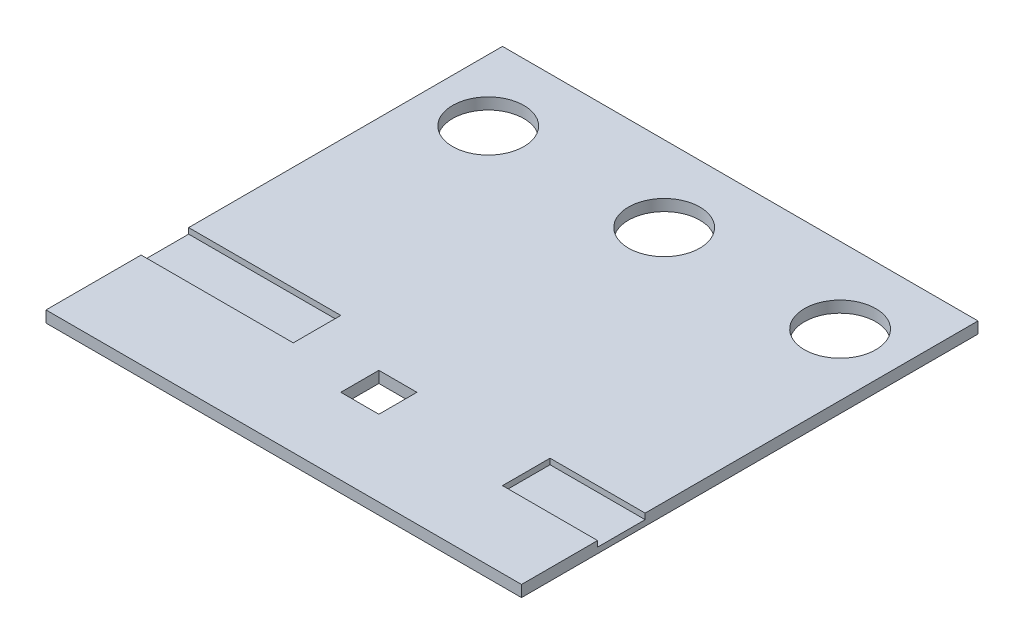
ISO-10303-21;
HEADER;
FILE_DESCRIPTION(('STEP AP214'),'2;1');
FILE_NAME('part.step','',(''),(''),'','','');
FILE_SCHEMA(('AUTOMOTIVE_DESIGN { 1 0 10303 214 1 1 1 1 }'));
ENDSEC;
DATA;
#1=APPLICATION_CONTEXT('core data for automotive mechanical design processes');
#2=APPLICATION_PROTOCOL_DEFINITION('international standard','automotive_design',2000,#1);
#3=PRODUCT_CONTEXT('',#1,'mechanical');
#4=PRODUCT('Part','Part','',(#3));
#5=PRODUCT_RELATED_PRODUCT_CATEGORY('part','',(#4));
#6=PRODUCT_DEFINITION_FORMATION('','',#4);
#7=PRODUCT_DEFINITION_CONTEXT('part definition',#1,'design');
#8=PRODUCT_DEFINITION('design','',#6,#7);
#9=PRODUCT_DEFINITION_SHAPE('','',#8);
#10=(LENGTH_UNIT() NAMED_UNIT(*) SI_UNIT(.MILLI.,.METRE.));
#11=(NAMED_UNIT(*) PLANE_ANGLE_UNIT() SI_UNIT($,.RADIAN.));
#12=(NAMED_UNIT(*) SI_UNIT($,.STERADIAN.) SOLID_ANGLE_UNIT());
#13=UNCERTAINTY_MEASURE_WITH_UNIT(LENGTH_MEASURE(1.E-05),#10,'distance_accuracy_value','');
#14=(GEOMETRIC_REPRESENTATION_CONTEXT(3) GLOBAL_UNCERTAINTY_ASSIGNED_CONTEXT((#13)) GLOBAL_UNIT_ASSIGNED_CONTEXT((#10,
#11,#12)) REPRESENTATION_CONTEXT('',''));
#15=CARTESIAN_POINT('',(0.,0.,0.));
#16=DIRECTION('',(0.,0.,1.));
#17=DIRECTION('',(1.,0.,0.));
#18=AXIS2_PLACEMENT_3D('',#15,#16,#17);
#19=CARTESIAN_POINT('',(2.,1.2,0.));
#20=DIRECTION('',(-1.,0.,0.));
#21=DIRECTION('',(0.,0.,1.));
#22=AXIS2_PLACEMENT_3D('',#19,#20,#21);
#23=PLANE('',#22);
#24=DIRECTION('',(0.,0.,-1.));
#25=VECTOR('',#24,1.);
#26=CARTESIAN_POINT('',(2.,0.,0.));
#27=LINE('',#26,#25);
#28=CARTESIAN_POINT('',(2.,0.,32.));
#29=VERTEX_POINT('',#28);
#30=CARTESIAN_POINT('',(2.,0.,28.));
#31=VERTEX_POINT('',#30);
#32=EDGE_CURVE('E223',#29,#31,#27,.T.);
#33=ORIENTED_EDGE('',*,*,#32,.F.);
#34=DIRECTION('',(0.,-1.,0.));
#35=VECTOR('',#34,1.);
#36=CARTESIAN_POINT('',(2.,1.2,32.));
#37=LINE('',#36,#35);
#38=CARTESIAN_POINT('',(2.,1.2,32.));
#39=VERTEX_POINT('',#38);
#40=EDGE_CURVE('E11',#39,#29,#37,.T.);
#41=ORIENTED_EDGE('',*,*,#40,.F.);
#42=DIRECTION('',(0.,0.,-1.));
#43=VECTOR('',#42,1.);
#44=CARTESIAN_POINT('',(2.,1.2,0.));
#45=LINE('',#44,#43);
#46=CARTESIAN_POINT('',(2.,1.2,28.));
#47=VERTEX_POINT('',#46);
#48=EDGE_CURVE('E252',#39,#47,#45,.T.);
#49=ORIENTED_EDGE('',*,*,#48,.T.);
#50=DIRECTION('',(0.,-1.,0.));
#51=VECTOR('',#50,1.);
#52=CARTESIAN_POINT('',(2.,1.2,28.));
#53=LINE('',#52,#51);
#54=EDGE_CURVE('E169',#47,#31,#53,.T.);
#55=ORIENTED_EDGE('',*,*,#54,.T.);
#56=EDGE_LOOP('',(#33,#41,#49,#55));
#57=FACE_BOUND('',#56,.T.);
#58=ADVANCED_FACE('F35',(#57),#23,.T.);
#59=CARTESIAN_POINT('',(0.,1.2,32.));
#60=DIRECTION('',(0.,0.,-1.));
#61=DIRECTION('',(-1.,0.,0.));
#62=AXIS2_PLACEMENT_3D('',#59,#60,#61);
#63=PLANE('',#62);
#64=DIRECTION('',(1.,0.,0.));
#65=VECTOR('',#64,1.);
#66=CARTESIAN_POINT('',(0.,0.,32.));
#67=LINE('',#66,#65);
#68=CARTESIAN_POINT('',(-2.,0.,32.));
#69=VERTEX_POINT('',#68);
#70=EDGE_CURVE('E220',#69,#29,#67,.T.);
#71=ORIENTED_EDGE('',*,*,#70,.F.);
#72=DIRECTION('',(0.,-1.,0.));
#73=VECTOR('',#72,1.);
#74=CARTESIAN_POINT('',(-2.,1.2,32.));
#75=LINE('',#74,#73);
#76=CARTESIAN_POINT('',(-2.,1.2,32.));
#77=VERTEX_POINT('',#76);
#78=EDGE_CURVE('E44',#77,#69,#75,.T.);
#79=ORIENTED_EDGE('',*,*,#78,.F.);
#80=DIRECTION('',(1.,0.,0.));
#81=VECTOR('',#80,1.);
#82=CARTESIAN_POINT('',(0.,1.2,32.));
#83=LINE('',#82,#81);
#84=EDGE_CURVE('E249',#77,#39,#83,.T.);
#85=ORIENTED_EDGE('',*,*,#84,.T.);
#86=ORIENTED_EDGE('',*,*,#40,.T.);
#87=EDGE_LOOP('',(#71,#79,#85,#86));
#88=FACE_BOUND('',#87,.T.);
#89=ADVANCED_FACE('F337',(#88),#63,.T.);
#90=CARTESIAN_POINT('',(-2.,1.2,0.));
#91=DIRECTION('',(-1.,0.,0.));
#92=DIRECTION('',(0.,0.,1.));
#93=AXIS2_PLACEMENT_3D('',#90,#91,#92);
#94=PLANE('',#93);
#95=DIRECTION('',(0.,0.,-1.));
#96=VECTOR('',#95,1.);
#97=CARTESIAN_POINT('',(-2.,0.,0.));
#98=LINE('',#97,#96);
#99=CARTESIAN_POINT('',(-2.,0.,28.));
#100=VERTEX_POINT('',#99);
#101=EDGE_CURVE('E217',#69,#100,#98,.T.);
#102=ORIENTED_EDGE('',*,*,#101,.T.);
#103=DIRECTION('',(0.,-1.,0.));
#104=VECTOR('',#103,1.);
#105=CARTESIAN_POINT('',(-2.,1.2,28.));
#106=LINE('',#105,#104);
#107=CARTESIAN_POINT('',(-2.,1.2,28.));
#108=VERTEX_POINT('',#107);
#109=EDGE_CURVE('E171',#108,#100,#106,.T.);
#110=ORIENTED_EDGE('',*,*,#109,.F.);
#111=DIRECTION('',(0.,0.,-1.));
#112=VECTOR('',#111,1.);
#113=CARTESIAN_POINT('',(-2.,1.2,0.));
#114=LINE('',#113,#112);
#115=EDGE_CURVE('E246',#77,#108,#114,.T.);
#116=ORIENTED_EDGE('',*,*,#115,.F.);
#117=ORIENTED_EDGE('',*,*,#78,.T.);
#118=EDGE_LOOP('',(#102,#110,#116,#117));
#119=FACE_BOUND('',#118,.T.);
#120=ADVANCED_FACE('F343',(#119),#94,.F.);
#121=CARTESIAN_POINT('',(15.,1.2,0.));
#122=DIRECTION('',(-1.,0.,0.));
#123=DIRECTION('',(0.,0.,1.));
#124=AXIS2_PLACEMENT_3D('',#121,#122,#123);
#125=PLANE('',#124);
#126=DIRECTION('',(0.,-1.,0.));
#127=VECTOR('',#126,1.);
#128=CARTESIAN_POINT('',(15.,1.2,32.));
#129=LINE('',#128,#127);
#130=CARTESIAN_POINT('',(15.,1.2,32.));
#131=VERTEX_POINT('',#130);
#132=CARTESIAN_POINT('',(15.,0.6,32.));
#133=VERTEX_POINT('',#132);
#134=EDGE_CURVE('E163',#131,#133,#129,.T.);
#135=ORIENTED_EDGE('',*,*,#134,.T.);
#136=DIRECTION('',(0.,0.,-1.));
#137=VECTOR('',#136,1.);
#138=CARTESIAN_POINT('',(15.,0.6,0.));
#139=LINE('',#138,#137);
#140=CARTESIAN_POINT('',(15.,0.6,27.));
#141=VERTEX_POINT('',#140);
#142=EDGE_CURVE('E150',#133,#141,#139,.T.);
#143=ORIENTED_EDGE('',*,*,#142,.T.);
#144=DIRECTION('',(0.,-1.,0.));
#145=VECTOR('',#144,1.);
#146=CARTESIAN_POINT('',(15.,1.2,27.));
#147=LINE('',#146,#145);
#148=CARTESIAN_POINT('',(15.,1.2,27.));
#149=VERTEX_POINT('',#148);
#150=EDGE_CURVE('E39',#149,#141,#147,.T.);
#151=ORIENTED_EDGE('',*,*,#150,.F.);
#152=DIRECTION('',(0.,0.,-1.));
#153=VECTOR('',#152,1.);
#154=CARTESIAN_POINT('',(15.,1.2,0.));
#155=LINE('',#154,#153);
#156=EDGE_CURVE('E207',#131,#149,#155,.T.);
#157=ORIENTED_EDGE('',*,*,#156,.F.);
#158=EDGE_LOOP('',(#135,#143,#151,#157));
#159=FACE_BOUND('',#158,.T.);
#160=ADVANCED_FACE('F37',(#159),#125,.F.);
#161=CARTESIAN_POINT('',(0.,1.2,27.));
#162=DIRECTION('',(0.,0.,-1.));
#163=DIRECTION('',(-1.,0.,0.));
#164=AXIS2_PLACEMENT_3D('',#161,#162,#163);
#165=PLANE('',#164);
#166=ORIENTED_EDGE('',*,*,#150,.T.);
#167=DIRECTION('',(1.,0.,0.));
#168=VECTOR('',#167,1.);
#169=CARTESIAN_POINT('',(0.,0.6,27.));
#170=LINE('',#169,#168);
#171=CARTESIAN_POINT('',(25.,0.6,27.));
#172=VERTEX_POINT('',#171);
#173=EDGE_CURVE('E147',#141,#172,#170,.T.);
#174=ORIENTED_EDGE('',*,*,#173,.T.);
#175=DIRECTION('',(0.,-1.,0.));
#176=VECTOR('',#175,1.);
#177=CARTESIAN_POINT('',(25.,1.2,27.));
#178=LINE('',#177,#176);
#179=CARTESIAN_POINT('',(25.,1.2,27.));
#180=VERTEX_POINT('',#179);
#181=EDGE_CURVE('E170',#180,#172,#178,.T.);
#182=ORIENTED_EDGE('',*,*,#181,.F.);
#183=DIRECTION('',(1.,0.,0.));
#184=VECTOR('',#183,1.);
#185=CARTESIAN_POINT('',(0.,1.2,27.));
#186=LINE('',#185,#184);
#187=EDGE_CURVE('E167',#149,#180,#186,.T.);
#188=ORIENTED_EDGE('',*,*,#187,.F.);
#189=EDGE_LOOP('',(#166,#174,#182,#188));
#190=FACE_BOUND('',#189,.T.);
#191=ADVANCED_FACE('F166',(#190),#165,.F.);
#192=CARTESIAN_POINT('',(0.,1.2,-8.));
#193=DIRECTION('',(0.,0.,-1.));
#194=DIRECTION('',(-1.,0.,0.));
#195=AXIS2_PLACEMENT_3D('',#192,#193,#194);
#196=PLANE('',#195);
#197=DIRECTION('',(1.,0.,0.));
#198=VECTOR('',#197,1.);
#199=CARTESIAN_POINT('',(0.,0.,-8.));
#200=LINE('',#199,#198);
#201=CARTESIAN_POINT('',(-25.,0.,-8.));
#202=VERTEX_POINT('',#201);
#203=CARTESIAN_POINT('',(25.,0.,-8.));
#204=VERTEX_POINT('',#203);
#205=EDGE_CURVE('E231',#202,#204,#200,.T.);
#206=ORIENTED_EDGE('',*,*,#205,.F.);
#207=DIRECTION('',(0.,-1.,0.));
#208=VECTOR('',#207,1.);
#209=CARTESIAN_POINT('',(-25.,1.2,-8.));
#210=LINE('',#209,#208);
#211=CARTESIAN_POINT('',(-25.,1.2,-8.));
#212=VERTEX_POINT('',#211);
#213=EDGE_CURVE('E177',#212,#202,#210,.T.);
#214=ORIENTED_EDGE('',*,*,#213,.F.);
#215=DIRECTION('',(1.,0.,0.));
#216=VECTOR('',#215,1.);
#217=CARTESIAN_POINT('',(0.,1.2,-8.));
#218=LINE('',#217,#216);
#219=CARTESIAN_POINT('',(25.,1.2,-8.));
#220=VERTEX_POINT('',#219);
#221=EDGE_CURVE('E273',#212,#220,#218,.T.);
#222=ORIENTED_EDGE('',*,*,#221,.T.);
#223=DIRECTION('',(0.,-1.,0.));
#224=VECTOR('',#223,1.);
#225=CARTESIAN_POINT('',(25.,1.2,-8.));
#226=LINE('',#225,#224);
#227=EDGE_CURVE('E173',#220,#204,#226,.T.);
#228=ORIENTED_EDGE('',*,*,#227,.T.);
#229=EDGE_LOOP('',(#206,#214,#222,#228));
#230=FACE_BOUND('',#229,.T.);
#231=ADVANCED_FACE('F312',(#230),#196,.T.);
#232=CARTESIAN_POINT('',(0.,1.2,25.));
#233=DIRECTION('',(0.,0.,-1.));
#234=DIRECTION('',(-1.,0.,0.));
#235=AXIS2_PLACEMENT_3D('',#232,#233,#234);
#236=PLANE('',#235);
#237=DIRECTION('',(0.,-1.,0.));
#238=VECTOR('',#237,1.);
#239=CARTESIAN_POINT('',(-25.,1.2,25.));
#240=LINE('',#239,#238);
#241=CARTESIAN_POINT('',(-25.,1.2,25.));
#242=VERTEX_POINT('',#241);
#243=CARTESIAN_POINT('',(-25.,0.6,25.));
#244=VERTEX_POINT('',#243);
#245=EDGE_CURVE('E52',#242,#244,#240,.T.);
#246=ORIENTED_EDGE('',*,*,#245,.T.);
#247=DIRECTION('',(1.,0.,0.));
#248=VECTOR('',#247,1.);
#249=CARTESIAN_POINT('',(0.,0.6,25.));
#250=LINE('',#249,#248);
#251=CARTESIAN_POINT('',(-9.,0.6,25.));
#252=VERTEX_POINT('',#251);
#253=EDGE_CURVE('E56',#244,#252,#250,.T.);
#254=ORIENTED_EDGE('',*,*,#253,.T.);
#255=DIRECTION('',(0.,-1.,0.));
#256=VECTOR('',#255,1.);
#257=CARTESIAN_POINT('',(-9.,1.2,25.));
#258=LINE('',#257,#256);
#259=CARTESIAN_POINT('',(-9.,1.2,25.));
#260=VERTEX_POINT('',#259);
#261=EDGE_CURVE('E183',#260,#252,#258,.T.);
#262=ORIENTED_EDGE('',*,*,#261,.F.);
#263=DIRECTION('',(1.,0.,0.));
#264=VECTOR('',#263,1.);
#265=CARTESIAN_POINT('',(0.,1.2,25.));
#266=LINE('',#265,#264);
#267=EDGE_CURVE('E268',#242,#260,#266,.T.);
#268=ORIENTED_EDGE('',*,*,#267,.F.);
#269=EDGE_LOOP('',(#246,#254,#262,#268));
#270=FACE_BOUND('',#269,.T.);
#271=ADVANCED_FACE('F318',(#270),#236,.F.);
#272=CARTESIAN_POINT('',(-9.,1.2,0.));
#273=DIRECTION('',(-1.,0.,0.));
#274=DIRECTION('',(0.,0.,1.));
#275=AXIS2_PLACEMENT_3D('',#272,#273,#274);
#276=PLANE('',#275);
#277=DIRECTION('',(0.,0.,-1.));
#278=VECTOR('',#277,1.);
#279=CARTESIAN_POINT('',(-9.,0.6,0.));
#280=LINE('',#279,#278);
#281=CARTESIAN_POINT('',(-9.,0.6,30.));
#282=VERTEX_POINT('',#281);
#283=EDGE_CURVE('E283',#282,#252,#280,.T.);
#284=ORIENTED_EDGE('',*,*,#283,.F.);
#285=DIRECTION('',(0.,-1.,0.));
#286=VECTOR('',#285,1.);
#287=CARTESIAN_POINT('',(-9.,1.2,30.));
#288=LINE('',#287,#286);
#289=CARTESIAN_POINT('',(-9.,1.2,30.));
#290=VERTEX_POINT('',#289);
#291=EDGE_CURVE('E185',#290,#282,#288,.T.);
#292=ORIENTED_EDGE('',*,*,#291,.F.);
#293=DIRECTION('',(0.,0.,-1.));
#294=VECTOR('',#293,1.);
#295=CARTESIAN_POINT('',(-9.,1.2,0.));
#296=LINE('',#295,#294);
#297=EDGE_CURVE('E265',#290,#260,#296,.T.);
#298=ORIENTED_EDGE('',*,*,#297,.T.);
#299=ORIENTED_EDGE('',*,*,#261,.T.);
#300=EDGE_LOOP('',(#284,#292,#298,#299));
#301=FACE_BOUND('',#300,.T.);
#302=ADVANCED_FACE('F327',(#301),#276,.T.);
#303=CARTESIAN_POINT('',(0.,1.2,30.));
#304=DIRECTION('',(0.,0.,-1.));
#305=DIRECTION('',(-1.,0.,0.));
#306=AXIS2_PLACEMENT_3D('',#303,#304,#305);
#307=PLANE('',#306);
#308=DIRECTION('',(1.,0.,0.));
#309=VECTOR('',#308,1.);
#310=CARTESIAN_POINT('',(0.,0.6,30.));
#311=LINE('',#310,#309);
#312=CARTESIAN_POINT('',(-25.,0.6,30.));
#313=VERTEX_POINT('',#312);
#314=EDGE_CURVE('E286',#313,#282,#311,.T.);
#315=ORIENTED_EDGE('',*,*,#314,.F.);
#316=DIRECTION('',(0.,-1.,0.));
#317=VECTOR('',#316,1.);
#318=CARTESIAN_POINT('',(-25.,1.2,30.));
#319=LINE('',#318,#317);
#320=CARTESIAN_POINT('',(-25.,1.2,30.));
#321=VERTEX_POINT('',#320);
#322=EDGE_CURVE('E188',#321,#313,#319,.T.);
#323=ORIENTED_EDGE('',*,*,#322,.F.);
#324=DIRECTION('',(1.,0.,0.));
#325=VECTOR('',#324,1.);
#326=CARTESIAN_POINT('',(0.,1.2,30.));
#327=LINE('',#326,#325);
#328=EDGE_CURVE('E262',#321,#290,#327,.T.);
#329=ORIENTED_EDGE('',*,*,#328,.T.);
#330=ORIENTED_EDGE('',*,*,#291,.T.);
#331=EDGE_LOOP('',(#315,#323,#329,#330));
#332=FACE_BOUND('',#331,.T.);
#333=ADVANCED_FACE('F324',(#332),#307,.T.);
#334=CARTESIAN_POINT('',(-25.,1.2,0.));
#335=DIRECTION('',(-1.,0.,0.));
#336=DIRECTION('',(0.,0.,1.));
#337=AXIS2_PLACEMENT_3D('',#334,#335,#336);
#338=PLANE('',#337);
#339=DIRECTION('',(0.,0.,-1.));
#340=VECTOR('',#339,1.);
#341=CARTESIAN_POINT('',(-25.,0.,0.));
#342=LINE('',#341,#340);
#343=CARTESIAN_POINT('',(-25.,0.,40.));
#344=VERTEX_POINT('',#343);
#345=EDGE_CURVE('E229',#344,#202,#342,.T.);
#346=ORIENTED_EDGE('',*,*,#345,.F.);
#347=DIRECTION('',(0.,-1.,0.));
#348=VECTOR('',#347,1.);
#349=CARTESIAN_POINT('',(-25.,1.2,40.));
#350=LINE('',#349,#348);
#351=CARTESIAN_POINT('',(-25.,1.2,40.));
#352=VERTEX_POINT('',#351);
#353=EDGE_CURVE('E191',#352,#344,#350,.T.);
#354=ORIENTED_EDGE('',*,*,#353,.F.);
#355=DIRECTION('',(0.,0.,-1.));
#356=VECTOR('',#355,1.);
#357=CARTESIAN_POINT('',(-25.,1.2,0.));
#358=LINE('',#357,#356);
#359=EDGE_CURVE('E261',#352,#321,#358,.T.);
#360=ORIENTED_EDGE('',*,*,#359,.T.);
#361=ORIENTED_EDGE('',*,*,#322,.T.);
#362=DIRECTION('',(0.,0.,-1.));
#363=VECTOR('',#362,1.);
#364=CARTESIAN_POINT('',(-25.,0.6,0.));
#365=LINE('',#364,#363);
#366=EDGE_CURVE('E234',#313,#244,#365,.T.);
#367=ORIENTED_EDGE('',*,*,#366,.T.);
#368=ORIENTED_EDGE('',*,*,#245,.F.);
#369=EDGE_CURVE('E270',#242,#212,#358,.T.);
#370=ORIENTED_EDGE('',*,*,#369,.T.);
#371=ORIENTED_EDGE('',*,*,#213,.T.);
#372=EDGE_LOOP('',(#346,#354,#360,#361,#367,#368,#370,#371));
#373=FACE_BOUND('',#372,.T.);
#374=ADVANCED_FACE('F316',(#373),#338,.T.);
#375=CARTESIAN_POINT('',(0.,1.2,40.));
#376=DIRECTION('',(0.,0.,-1.));
#377=DIRECTION('',(-1.,0.,0.));
#378=AXIS2_PLACEMENT_3D('',#375,#376,#377);
#379=PLANE('',#378);
#380=DIRECTION('',(1.,0.,0.));
#381=VECTOR('',#380,1.);
#382=CARTESIAN_POINT('',(0.,0.,40.));
#383=LINE('',#382,#381);
#384=CARTESIAN_POINT('',(25.,0.,40.));
#385=VERTEX_POINT('',#384);
#386=EDGE_CURVE('E227',#344,#385,#383,.T.);
#387=ORIENTED_EDGE('',*,*,#386,.T.);
#388=DIRECTION('',(0.,-1.,0.));
#389=VECTOR('',#388,1.);
#390=CARTESIAN_POINT('',(25.,1.2,40.));
#391=LINE('',#390,#389);
#392=CARTESIAN_POINT('',(25.,1.2,40.));
#393=VERTEX_POINT('',#392);
#394=EDGE_CURVE('E193',#393,#385,#391,.T.);
#395=ORIENTED_EDGE('',*,*,#394,.F.);
#396=DIRECTION('',(1.,0.,0.));
#397=VECTOR('',#396,1.);
#398=CARTESIAN_POINT('',(0.,1.2,40.));
#399=LINE('',#398,#397);
#400=EDGE_CURVE('E259',#352,#393,#399,.T.);
#401=ORIENTED_EDGE('',*,*,#400,.F.);
#402=ORIENTED_EDGE('',*,*,#353,.T.);
#403=EDGE_LOOP('',(#387,#395,#401,#402));
#404=FACE_BOUND('',#403,.T.);
#405=ADVANCED_FACE('F356',(#404),#379,.F.);
#406=CARTESIAN_POINT('',(25.,1.2,0.));
#407=DIRECTION('',(-1.,0.,0.));
#408=DIRECTION('',(0.,0.,1.));
#409=AXIS2_PLACEMENT_3D('',#406,#407,#408);
#410=PLANE('',#409);
#411=DIRECTION('',(0.,0.,-1.));
#412=VECTOR('',#411,1.);
#413=CARTESIAN_POINT('',(25.,0.,0.));
#414=LINE('',#413,#412);
#415=EDGE_CURVE('E226',#385,#204,#414,.T.);
#416=ORIENTED_EDGE('',*,*,#415,.T.);
#417=ORIENTED_EDGE('',*,*,#227,.F.);
#418=DIRECTION('',(0.,0.,-1.));
#419=VECTOR('',#418,1.);
#420=CARTESIAN_POINT('',(25.,1.2,0.));
#421=LINE('',#420,#419);
#422=EDGE_CURVE('E276',#180,#220,#421,.T.);
#423=ORIENTED_EDGE('',*,*,#422,.F.);
#424=ORIENTED_EDGE('',*,*,#181,.T.);
#425=DIRECTION('',(0.,0.,-1.));
#426=VECTOR('',#425,1.);
#427=CARTESIAN_POINT('',(25.,0.6,0.));
#428=LINE('',#427,#426);
#429=CARTESIAN_POINT('',(25.,0.6,32.));
#430=VERTEX_POINT('',#429);
#431=EDGE_CURVE('E153',#430,#172,#428,.T.);
#432=ORIENTED_EDGE('',*,*,#431,.F.);
#433=DIRECTION('',(0.,-1.,0.));
#434=VECTOR('',#433,1.);
#435=CARTESIAN_POINT('',(25.,1.2,32.));
#436=LINE('',#435,#434);
#437=CARTESIAN_POINT('',(25.,1.2,32.));
#438=VERTEX_POINT('',#437);
#439=EDGE_CURVE('E196',#438,#430,#436,.T.);
#440=ORIENTED_EDGE('',*,*,#439,.F.);
#441=EDGE_CURVE('E258',#393,#438,#421,.T.);
#442=ORIENTED_EDGE('',*,*,#441,.F.);
#443=ORIENTED_EDGE('',*,*,#394,.T.);
#444=EDGE_LOOP('',(#416,#417,#423,#424,#432,#440,#442,#443));
#445=FACE_BOUND('',#444,.T.);
#446=ADVANCED_FACE('F292',(#445),#410,.F.);
#447=CARTESIAN_POINT('',(18.5,1.2,0.));
#448=DIRECTION('',(0.,-1.,0.));
#449=DIRECTION('',(0.,0.,-1.));
#450=AXIS2_PLACEMENT_3D('',#447,#448,#449);
#451=CYLINDRICAL_SURFACE('',#450,3.7500052);
#452=CARTESIAN_POINT('',(18.5,1.2,0.));
#453=DIRECTION('',(0.,1.,0.));
#454=DIRECTION('',(0.,0.,1.));
#455=AXIS2_PLACEMENT_3D('',#452,#453,#454);
#456=CIRCLE('',#455,3.7500052);
#457=CARTESIAN_POINT('',(18.5,1.2,3.7500052));
#458=VERTEX_POINT('',#457);
#459=EDGE_CURVE('E238',#458,#458,#456,.T.);
#460=ORIENTED_EDGE('',*,*,#459,.T.);
#461=EDGE_LOOP('',(#460));
#462=FACE_BOUND('',#461,.T.);
#463=CARTESIAN_POINT('',(18.5,0.,0.));
#464=DIRECTION('',(0.,1.,0.));
#465=DIRECTION('',(0.,0.,1.));
#466=AXIS2_PLACEMENT_3D('',#463,#464,#465);
#467=CIRCLE('',#466,3.7500052);
#468=CARTESIAN_POINT('',(18.5,0.,3.7500052));
#469=VERTEX_POINT('',#468);
#470=EDGE_CURVE('E208',#469,#469,#467,.T.);
#471=ORIENTED_EDGE('',*,*,#470,.F.);
#472=EDGE_LOOP('',(#471));
#473=FACE_BOUND('',#472,.T.);
#474=ADVANCED_FACE('F355',(#462,#473),#451,.F.);
#475=CARTESIAN_POINT('',(0.,1.2,0.));
#476=DIRECTION('',(0.,-1.,0.));
#477=DIRECTION('',(0.,0.,-1.));
#478=AXIS2_PLACEMENT_3D('',#475,#476,#477);
#479=CYLINDRICAL_SURFACE('',#478,3.7500052);
#480=CARTESIAN_POINT('',(0.,1.2,0.));
#481=DIRECTION('',(0.,1.,0.));
#482=DIRECTION('',(0.,0.,1.));
#483=AXIS2_PLACEMENT_3D('',#480,#481,#482);
#484=CIRCLE('',#483,3.7500052);
#485=CARTESIAN_POINT('',(0.,1.2,3.7500052));
#486=VERTEX_POINT('',#485);
#487=EDGE_CURVE('E241',#486,#486,#484,.T.);
#488=ORIENTED_EDGE('',*,*,#487,.T.);
#489=EDGE_LOOP('',(#488));
#490=FACE_BOUND('',#489,.T.);
#491=CARTESIAN_POINT('',(0.,0.,0.));
#492=DIRECTION('',(0.,1.,0.));
#493=DIRECTION('',(0.,0.,1.));
#494=AXIS2_PLACEMENT_3D('',#491,#492,#493);
#495=CIRCLE('',#494,3.7500052);
#496=CARTESIAN_POINT('',(0.,0.,3.7500052));
#497=VERTEX_POINT('',#496);
#498=EDGE_CURVE('E211',#497,#497,#495,.T.);
#499=ORIENTED_EDGE('',*,*,#498,.F.);
#500=EDGE_LOOP('',(#499));
#501=FACE_BOUND('',#500,.T.);
#502=ADVANCED_FACE('F380',(#490,#501),#479,.F.);
#503=CARTESIAN_POINT('',(0.,1.2,28.));
#504=DIRECTION('',(0.,0.,-1.));
#505=DIRECTION('',(-1.,0.,0.));
#506=AXIS2_PLACEMENT_3D('',#503,#504,#505);
#507=PLANE('',#506);
#508=DIRECTION('',(1.,0.,0.));
#509=VECTOR('',#508,1.);
#510=CARTESIAN_POINT('',(0.,0.,28.));
#511=LINE('',#510,#509);
#512=EDGE_CURVE('E214',#100,#31,#511,.T.);
#513=ORIENTED_EDGE('',*,*,#512,.T.);
#514=ORIENTED_EDGE('',*,*,#54,.F.);
#515=DIRECTION('',(1.,0.,0.));
#516=VECTOR('',#515,1.);
#517=CARTESIAN_POINT('',(0.,1.2,28.));
#518=LINE('',#517,#516);
#519=EDGE_CURVE('E244',#108,#47,#518,.T.);
#520=ORIENTED_EDGE('',*,*,#519,.F.);
#521=ORIENTED_EDGE('',*,*,#109,.T.);
#522=EDGE_LOOP('',(#513,#514,#520,#521));
#523=FACE_BOUND('',#522,.T.);
#524=ADVANCED_FACE('F352',(#523),#507,.F.);
#525=CARTESIAN_POINT('',(0.,1.2,32.));
#526=DIRECTION('',(0.,0.,-1.));
#527=DIRECTION('',(-1.,0.,0.));
#528=AXIS2_PLACEMENT_3D('',#525,#526,#527);
#529=PLANE('',#528);
#530=DIRECTION('',(1.,0.,0.));
#531=VECTOR('',#530,1.);
#532=CARTESIAN_POINT('',(0.,0.6,32.));
#533=LINE('',#532,#531);
#534=EDGE_CURVE('E164',#133,#430,#533,.T.);
#535=ORIENTED_EDGE('',*,*,#534,.F.);
#536=ORIENTED_EDGE('',*,*,#134,.F.);
#537=DIRECTION('',(1.,0.,0.));
#538=VECTOR('',#537,1.);
#539=CARTESIAN_POINT('',(0.,1.2,32.));
#540=LINE('',#539,#538);
#541=EDGE_CURVE('E255',#131,#438,#540,.T.);
#542=ORIENTED_EDGE('',*,*,#541,.T.);
#543=ORIENTED_EDGE('',*,*,#439,.T.);
#544=EDGE_LOOP('',(#535,#536,#542,#543));
#545=FACE_BOUND('',#544,.T.);
#546=ADVANCED_FACE('F294',(#545),#529,.T.);
#547=CARTESIAN_POINT('',(-18.5,1.2,0.));
#548=DIRECTION('',(0.,-1.,0.));
#549=DIRECTION('',(0.,0.,-1.));
#550=AXIS2_PLACEMENT_3D('',#547,#548,#549);
#551=CYLINDRICAL_SURFACE('',#550,3.7500052);
#552=CARTESIAN_POINT('',(-18.5,1.2,0.));
#553=DIRECTION('',(0.,1.,0.));
#554=DIRECTION('',(0.,0.,1.));
#555=AXIS2_PLACEMENT_3D('',#552,#553,#554);
#556=CIRCLE('',#555,3.7500052);
#557=CARTESIAN_POINT('',(-18.5,1.2,3.7500052));
#558=VERTEX_POINT('',#557);
#559=EDGE_CURVE('E199',#558,#558,#556,.F.);
#560=ORIENTED_EDGE('',*,*,#559,.F.);
#561=EDGE_LOOP('',(#560));
#562=FACE_BOUND('',#561,.T.);
#563=CARTESIAN_POINT('',(-18.5,0.,0.));
#564=DIRECTION('',(0.,1.,0.));
#565=DIRECTION('',(0.,0.,1.));
#566=AXIS2_PLACEMENT_3D('',#563,#564,#565);
#567=CIRCLE('',#566,3.7500052);
#568=CARTESIAN_POINT('',(-18.5,0.,3.7500052));
#569=VERTEX_POINT('',#568);
#570=EDGE_CURVE('E204',#569,#569,#567,.F.);
#571=ORIENTED_EDGE('',*,*,#570,.T.);
#572=EDGE_LOOP('',(#571));
#573=FACE_BOUND('',#572,.T.);
#574=ADVANCED_FACE('F351',(#562,#573),#551,.F.);
#575=CARTESIAN_POINT('',(0.,1.2,0.));
#576=DIRECTION('',(0.,1.,0.));
#577=DIRECTION('',(0.,0.,1.));
#578=AXIS2_PLACEMENT_3D('',#575,#576,#577);
#579=PLANE('',#578);
#580=ORIENTED_EDGE('',*,*,#156,.T.);
#581=ORIENTED_EDGE('',*,*,#187,.T.);
#582=ORIENTED_EDGE('',*,*,#422,.T.);
#583=ORIENTED_EDGE('',*,*,#221,.F.);
#584=ORIENTED_EDGE('',*,*,#369,.F.);
#585=ORIENTED_EDGE('',*,*,#267,.T.);
#586=ORIENTED_EDGE('',*,*,#297,.F.);
#587=ORIENTED_EDGE('',*,*,#328,.F.);
#588=ORIENTED_EDGE('',*,*,#359,.F.);
#589=ORIENTED_EDGE('',*,*,#400,.T.);
#590=ORIENTED_EDGE('',*,*,#441,.T.);
#591=ORIENTED_EDGE('',*,*,#541,.F.);
#592=EDGE_LOOP('',(#580,#581,#582,#583,#584,#585,#586,#587,#588,#589,#590,#591));
#593=FACE_BOUND('',#592,.T.);
#594=ORIENTED_EDGE('',*,*,#48,.F.);
#595=ORIENTED_EDGE('',*,*,#84,.F.);
#596=ORIENTED_EDGE('',*,*,#115,.T.);
#597=ORIENTED_EDGE('',*,*,#519,.T.);
#598=EDGE_LOOP('',(#594,#595,#596,#597));
#599=FACE_BOUND('',#598,.T.);
#600=ORIENTED_EDGE('',*,*,#487,.F.);
#601=EDGE_LOOP('',(#600));
#602=FACE_BOUND('',#601,.T.);
#603=ORIENTED_EDGE('',*,*,#459,.F.);
#604=EDGE_LOOP('',(#603));
#605=FACE_BOUND('',#604,.T.);
#606=ORIENTED_EDGE('',*,*,#559,.T.);
#607=EDGE_LOOP('',(#606));
#608=FACE_BOUND('',#607,.T.);
#609=ADVANCED_FACE('F297',(#593,#599,#602,#605,#608),#579,.T.);
#610=CARTESIAN_POINT('',(0.,0.,0.));
#611=DIRECTION('',(0.,1.,0.));
#612=DIRECTION('',(0.,0.,1.));
#613=AXIS2_PLACEMENT_3D('',#610,#611,#612);
#614=PLANE('',#613);
#615=ORIENTED_EDGE('',*,*,#205,.T.);
#616=ORIENTED_EDGE('',*,*,#415,.F.);
#617=ORIENTED_EDGE('',*,*,#386,.F.);
#618=ORIENTED_EDGE('',*,*,#345,.T.);
#619=EDGE_LOOP('',(#615,#616,#617,#618));
#620=FACE_BOUND('',#619,.T.);
#621=ORIENTED_EDGE('',*,*,#32,.T.);
#622=ORIENTED_EDGE('',*,*,#512,.F.);
#623=ORIENTED_EDGE('',*,*,#101,.F.);
#624=ORIENTED_EDGE('',*,*,#70,.T.);
#625=EDGE_LOOP('',(#621,#622,#623,#624));
#626=FACE_BOUND('',#625,.T.);
#627=ORIENTED_EDGE('',*,*,#498,.T.);
#628=EDGE_LOOP('',(#627));
#629=FACE_BOUND('',#628,.T.);
#630=ORIENTED_EDGE('',*,*,#470,.T.);
#631=EDGE_LOOP('',(#630));
#632=FACE_BOUND('',#631,.T.);
#633=ORIENTED_EDGE('',*,*,#570,.F.);
#634=EDGE_LOOP('',(#633));
#635=FACE_BOUND('',#634,.T.);
#636=ADVANCED_FACE('F307',(#620,#626,#629,#632,#635),#614,.F.);
#637=CARTESIAN_POINT('',(0.,0.6,0.));
#638=DIRECTION('',(0.,1.,0.));
#639=DIRECTION('',(0.,0.,1.));
#640=AXIS2_PLACEMENT_3D('',#637,#638,#639);
#641=PLANE('',#640);
#642=ORIENTED_EDGE('',*,*,#314,.T.);
#643=ORIENTED_EDGE('',*,*,#283,.T.);
#644=ORIENTED_EDGE('',*,*,#253,.F.);
#645=ORIENTED_EDGE('',*,*,#366,.F.);
#646=EDGE_LOOP('',(#642,#643,#644,#645));
#647=FACE_BOUND('',#646,.T.);
#648=ADVANCED_FACE('F326',(#647),#641,.T.);
#649=CARTESIAN_POINT('',(0.,0.6,0.));
#650=DIRECTION('',(0.,1.,0.));
#651=DIRECTION('',(0.,0.,1.));
#652=AXIS2_PLACEMENT_3D('',#649,#650,#651);
#653=PLANE('',#652);
#654=ORIENTED_EDGE('',*,*,#173,.F.);
#655=ORIENTED_EDGE('',*,*,#142,.F.);
#656=ORIENTED_EDGE('',*,*,#534,.T.);
#657=ORIENTED_EDGE('',*,*,#431,.T.);
#658=EDGE_LOOP('',(#654,#655,#656,#657));
#659=FACE_BOUND('',#658,.T.);
#660=ADVANCED_FACE('F149',(#659),#653,.T.);
#661=CLOSED_SHELL('',(#58,#89,#120,#160,#191,#231,#271,#302,#333,#374,#405,#446,#474,#502,#524,
#546,#574,#609,#636,#648,#660));
#662=MANIFOLD_SOLID_BREP('B2',#661);
#663=ADVANCED_BREP_SHAPE_REPRESENTATION('',(#18,#662),#14);
#664=SHAPE_DEFINITION_REPRESENTATION(#9,#663);
ENDSEC;
END-ISO-10303-21;
